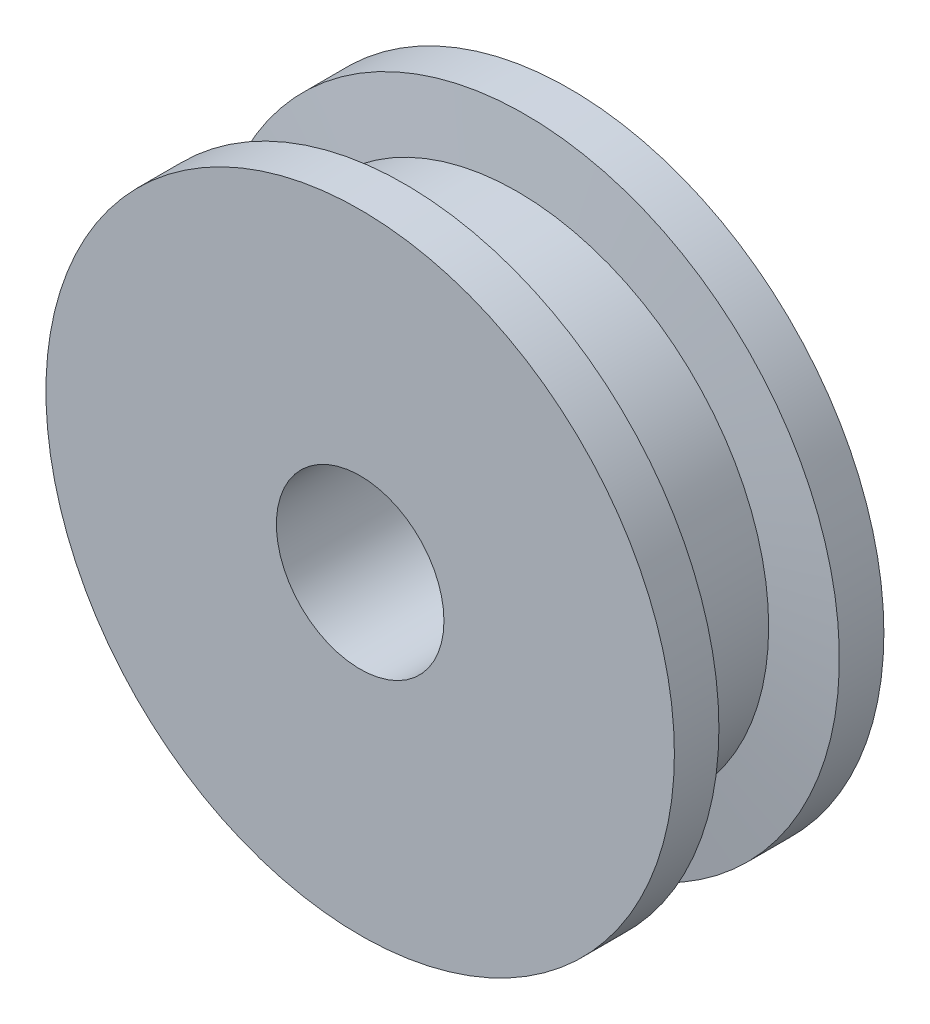
ISO-10303-21;
HEADER;
FILE_DESCRIPTION(('STEP AP214'),'2;1');
FILE_NAME('part.step','',(''),(''),'','','');
FILE_SCHEMA(('AUTOMOTIVE_DESIGN { 1 0 10303 214 1 1 1 1 }'));
ENDSEC;
DATA;
#1=APPLICATION_CONTEXT('core data for automotive mechanical design processes');
#2=APPLICATION_PROTOCOL_DEFINITION('international standard','automotive_design',2000,#1);
#3=PRODUCT_CONTEXT('',#1,'mechanical');
#4=PRODUCT('Part','Part','',(#3));
#5=PRODUCT_RELATED_PRODUCT_CATEGORY('part','',(#4));
#6=PRODUCT_DEFINITION_FORMATION('','',#4);
#7=PRODUCT_DEFINITION_CONTEXT('part definition',#1,'design');
#8=PRODUCT_DEFINITION('design','',#6,#7);
#9=PRODUCT_DEFINITION_SHAPE('','',#8);
#10=(LENGTH_UNIT() NAMED_UNIT(*) SI_UNIT(.MILLI.,.METRE.));
#11=(NAMED_UNIT(*) PLANE_ANGLE_UNIT() SI_UNIT($,.RADIAN.));
#12=(NAMED_UNIT(*) SI_UNIT($,.STERADIAN.) SOLID_ANGLE_UNIT());
#13=UNCERTAINTY_MEASURE_WITH_UNIT(LENGTH_MEASURE(1.E-05),#10,'distance_accuracy_value','');
#14=(GEOMETRIC_REPRESENTATION_CONTEXT(3) GLOBAL_UNCERTAINTY_ASSIGNED_CONTEXT((#13)) GLOBAL_UNIT_ASSIGNED_CONTEXT((#10,
#11,#12)) REPRESENTATION_CONTEXT('',''));
#15=CARTESIAN_POINT('',(0.,0.,0.));
#16=DIRECTION('',(0.,0.,1.));
#17=DIRECTION('',(1.,0.,0.));
#18=AXIS2_PLACEMENT_3D('',#15,#16,#17);
#19=CARTESIAN_POINT('',(0.,0.,10.));
#20=DIRECTION('',(0.,0.,-1.));
#21=DIRECTION('',(-1.,0.,0.));
#22=AXIS2_PLACEMENT_3D('',#19,#20,#21);
#23=CYLINDRICAL_SURFACE('',#22,15.);
#24=CARTESIAN_POINT('',(0.,0.,0.));
#25=DIRECTION('',(0.,0.,1.));
#26=DIRECTION('',(1.,0.,0.));
#27=AXIS2_PLACEMENT_3D('',#24,#25,#26);
#28=CIRCLE('',#27,15.);
#29=CARTESIAN_POINT('',(15.,0.,0.));
#30=VERTEX_POINT('',#29);
#31=EDGE_CURVE('E38',#30,#30,#28,.T.);
#32=ORIENTED_EDGE('',*,*,#31,.T.);
#33=EDGE_LOOP('',(#32));
#34=FACE_BOUND('',#33,.T.);
#35=CARTESIAN_POINT('',(0.,0.,2.125));
#36=DIRECTION('',(0.,0.,-1.));
#37=DIRECTION('',(-1.,0.,0.));
#38=AXIS2_PLACEMENT_3D('',#35,#36,#37);
#39=CIRCLE('',#38,15.);
#40=CARTESIAN_POINT('',(-15.,0.,2.125));
#41=VERTEX_POINT('',#40);
#42=EDGE_CURVE('E34',#41,#41,#39,.F.);
#43=ORIENTED_EDGE('',*,*,#42,.F.);
#44=EDGE_LOOP('',(#43));
#45=FACE_BOUND('',#44,.T.);
#46=ADVANCED_FACE('F31',(#34,#45),#23,.T.);
#47=CARTESIAN_POINT('',(0.,0.,0.));
#48=DIRECTION('',(0.,0.,1.));
#49=DIRECTION('',(1.,0.,0.));
#50=AXIS2_PLACEMENT_3D('',#47,#48,#49);
#51=PLANE('',#50);
#52=CARTESIAN_POINT('',(0.,0.,0.));
#53=DIRECTION('',(0.,0.,1.));
#54=DIRECTION('',(1.,0.,0.));
#55=AXIS2_PLACEMENT_3D('',#52,#53,#54);
#56=CIRCLE('',#55,4.);
#57=CARTESIAN_POINT('',(4.,0.,0.));
#58=VERTEX_POINT('',#57);
#59=EDGE_CURVE('E57',#58,#58,#56,.T.);
#60=ORIENTED_EDGE('',*,*,#59,.T.);
#61=EDGE_LOOP('',(#60));
#62=FACE_BOUND('',#61,.T.);
#63=ORIENTED_EDGE('',*,*,#31,.F.);
#64=EDGE_LOOP('',(#63));
#65=FACE_BOUND('',#64,.T.);
#66=ADVANCED_FACE('F83',(#62,#65),#51,.F.);
#67=CARTESIAN_POINT('',(0.,0.,2.5));
#68=DIRECTION('',(0.,0.,-1.));
#69=DIRECTION('',(-1.,0.,0.));
#70=AXIS2_PLACEMENT_3D('',#67,#68,#69);
#71=CONICAL_SURFACE('',#70,12.,1.44644133224814);
#72=CARTESIAN_POINT('',(0.,0.,2.5));
#73=DIRECTION('',(0.,0.,1.));
#74=DIRECTION('',(1.,0.,0.));
#75=AXIS2_PLACEMENT_3D('',#72,#73,#74);
#76=CIRCLE('',#75,12.);
#77=CARTESIAN_POINT('',(12.,0.,2.5));
#78=VERTEX_POINT('',#77);
#79=EDGE_CURVE('E45',#78,#78,#76,.T.);
#80=ORIENTED_EDGE('',*,*,#79,.F.);
#81=EDGE_LOOP('',(#80));
#82=FACE_BOUND('',#81,.T.);
#83=ORIENTED_EDGE('',*,*,#42,.T.);
#84=EDGE_LOOP('',(#83));
#85=FACE_BOUND('',#84,.T.);
#86=ADVANCED_FACE('F88',(#82,#85),#71,.T.);
#87=CARTESIAN_POINT('',(0.,0.,8.));
#88=DIRECTION('',(0.,0.,1.));
#89=DIRECTION('',(1.,0.,0.));
#90=AXIS2_PLACEMENT_3D('',#87,#88,#89);
#91=CONICAL_SURFACE('',#90,16.,1.44644133224814);
#92=CARTESIAN_POINT('',(0.,0.,7.5));
#93=DIRECTION('',(0.,0.,1.));
#94=DIRECTION('',(1.,0.,0.));
#95=AXIS2_PLACEMENT_3D('',#92,#93,#94);
#96=CIRCLE('',#95,12.);
#97=CARTESIAN_POINT('',(12.,0.,7.5));
#98=VERTEX_POINT('',#97);
#99=EDGE_CURVE('E53',#98,#98,#96,.T.);
#100=ORIENTED_EDGE('',*,*,#99,.T.);
#101=EDGE_LOOP('',(#100));
#102=FACE_BOUND('',#101,.T.);
#103=CARTESIAN_POINT('',(0.,0.,7.875));
#104=DIRECTION('',(0.,0.,1.));
#105=DIRECTION('',(1.,0.,0.));
#106=AXIS2_PLACEMENT_3D('',#103,#104,#105);
#107=CIRCLE('',#106,15.);
#108=CARTESIAN_POINT('',(15.,0.,7.875));
#109=VERTEX_POINT('',#108);
#110=EDGE_CURVE('E47',#109,#109,#107,.F.);
#111=ORIENTED_EDGE('',*,*,#110,.T.);
#112=EDGE_LOOP('',(#111));
#113=FACE_BOUND('',#112,.T.);
#114=ADVANCED_FACE('F79',(#102,#113),#91,.T.);
#115=CARTESIAN_POINT('',(0.,0.,10.));
#116=DIRECTION('',(0.,0.,1.));
#117=DIRECTION('',(1.,0.,0.));
#118=AXIS2_PLACEMENT_3D('',#115,#116,#117);
#119=CYLINDRICAL_SURFACE('',#118,12.);
#120=ORIENTED_EDGE('',*,*,#79,.T.);
#121=EDGE_LOOP('',(#120));
#122=FACE_BOUND('',#121,.T.);
#123=ORIENTED_EDGE('',*,*,#99,.F.);
#124=EDGE_LOOP('',(#123));
#125=FACE_BOUND('',#124,.T.);
#126=ADVANCED_FACE('F72',(#122,#125),#119,.T.);
#127=CARTESIAN_POINT('',(0.,0.,10.));
#128=DIRECTION('',(0.,0.,1.));
#129=DIRECTION('',(1.,0.,0.));
#130=AXIS2_PLACEMENT_3D('',#127,#128,#129);
#131=PLANE('',#130);
#132=CARTESIAN_POINT('',(0.,0.,10.));
#133=DIRECTION('',(0.,0.,1.));
#134=DIRECTION('',(1.,0.,0.));
#135=AXIS2_PLACEMENT_3D('',#132,#133,#134);
#136=CIRCLE('',#135,4.);
#137=CARTESIAN_POINT('',(4.,0.,10.));
#138=VERTEX_POINT('',#137);
#139=EDGE_CURVE('E61',#138,#138,#136,.T.);
#140=ORIENTED_EDGE('',*,*,#139,.F.);
#141=EDGE_LOOP('',(#140));
#142=FACE_BOUND('',#141,.T.);
#143=CARTESIAN_POINT('',(0.,0.,10.));
#144=DIRECTION('',(0.,0.,1.));
#145=DIRECTION('',(1.,0.,0.));
#146=AXIS2_PLACEMENT_3D('',#143,#144,#145);
#147=CIRCLE('',#146,15.);
#148=CARTESIAN_POINT('',(15.,0.,10.));
#149=VERTEX_POINT('',#148);
#150=EDGE_CURVE('E10',#149,#149,#147,.T.);
#151=ORIENTED_EDGE('',*,*,#150,.T.);
#152=EDGE_LOOP('',(#151));
#153=FACE_BOUND('',#152,.T.);
#154=ADVANCED_FACE('F69',(#142,#153),#131,.T.);
#155=ORIENTED_EDGE('',*,*,#150,.F.);
#156=EDGE_LOOP('',(#155));
#157=FACE_BOUND('',#156,.T.);
#158=ORIENTED_EDGE('',*,*,#110,.F.);
#159=EDGE_LOOP('',(#158));
#160=FACE_BOUND('',#159,.T.);
#161=ADVANCED_FACE('F71',(#157,#160),#23,.T.);
#162=CARTESIAN_POINT('',(0.,0.,0.));
#163=DIRECTION('',(0.,0.,1.));
#164=DIRECTION('',(1.,0.,0.));
#165=AXIS2_PLACEMENT_3D('',#162,#163,#164);
#166=CYLINDRICAL_SURFACE('',#165,4.);
#167=ORIENTED_EDGE('',*,*,#59,.F.);
#168=EDGE_LOOP('',(#167));
#169=FACE_BOUND('',#168,.T.);
#170=ORIENTED_EDGE('',*,*,#139,.T.);
#171=EDGE_LOOP('',(#170));
#172=FACE_BOUND('',#171,.T.);
#173=ADVANCED_FACE('F67',(#169,#172),#166,.F.);
#174=CLOSED_SHELL('',(#46,#66,#86,#114,#126,#154,#161,#173));
#175=MANIFOLD_SOLID_BREP('B2',#174);
#176=ADVANCED_BREP_SHAPE_REPRESENTATION('',(#18,#175),#14);
#177=SHAPE_DEFINITION_REPRESENTATION(#9,#176);
ENDSEC;
END-ISO-10303-21;
